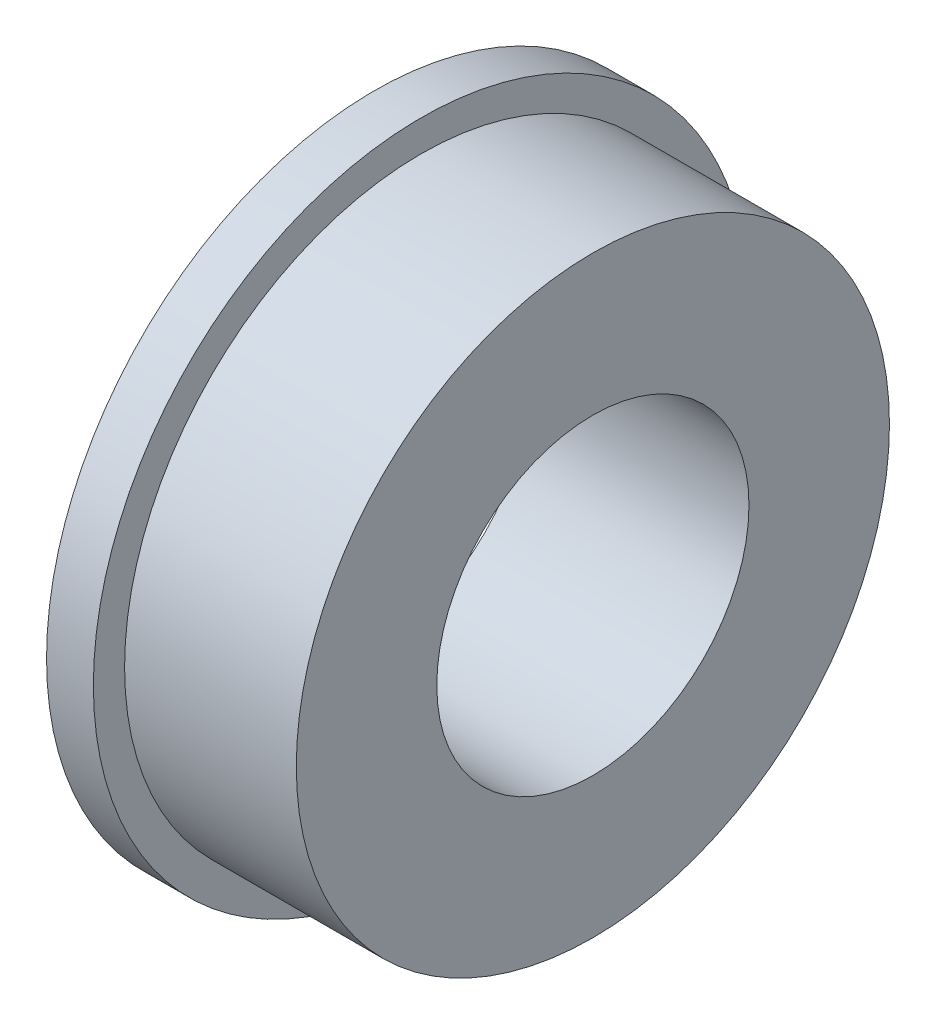
ISO-10303-21;
HEADER;
FILE_DESCRIPTION(('STEP AP214'),'2;1');
FILE_NAME('part.step','',(''),(''),'','','');
FILE_SCHEMA(('AUTOMOTIVE_DESIGN { 1 0 10303 214 1 1 1 1 }'));
ENDSEC;
DATA;
#1=APPLICATION_CONTEXT('core data for automotive mechanical design processes');
#2=APPLICATION_PROTOCOL_DEFINITION('international standard','automotive_design',2000,#1);
#3=PRODUCT_CONTEXT('',#1,'mechanical');
#4=PRODUCT('Part','Part','',(#3));
#5=PRODUCT_RELATED_PRODUCT_CATEGORY('part','',(#4));
#6=PRODUCT_DEFINITION_FORMATION('','',#4);
#7=PRODUCT_DEFINITION_CONTEXT('part definition',#1,'design');
#8=PRODUCT_DEFINITION('design','',#6,#7);
#9=PRODUCT_DEFINITION_SHAPE('','',#8);
#10=(LENGTH_UNIT() NAMED_UNIT(*) SI_UNIT(.MILLI.,.METRE.));
#11=(NAMED_UNIT(*) PLANE_ANGLE_UNIT() SI_UNIT($,.RADIAN.));
#12=(NAMED_UNIT(*) SI_UNIT($,.STERADIAN.) SOLID_ANGLE_UNIT());
#13=UNCERTAINTY_MEASURE_WITH_UNIT(LENGTH_MEASURE(1.E-05),#10,'distance_accuracy_value','');
#14=(GEOMETRIC_REPRESENTATION_CONTEXT(3) GLOBAL_UNCERTAINTY_ASSIGNED_CONTEXT((#13)) GLOBAL_UNIT_ASSIGNED_CONTEXT((#10,
#11,#12)) REPRESENTATION_CONTEXT('',''));
#15=CARTESIAN_POINT('',(0.,0.,0.));
#16=DIRECTION('',(0.,0.,1.));
#17=DIRECTION('',(1.,0.,0.));
#18=AXIS2_PLACEMENT_3D('',#15,#16,#17);
#19=CARTESIAN_POINT('',(-26.0941560134311,0.,0.));
#20=DIRECTION('',(-1.,0.,0.));
#21=DIRECTION('',(0.,0.,1.));
#22=AXIS2_PLACEMENT_3D('',#19,#20,#21);
#23=CYLINDRICAL_SURFACE('',#22,9.5);
#24=CARTESIAN_POINT('',(1.5,0.,0.));
#25=DIRECTION('',(-1.,0.,0.));
#26=DIRECTION('',(0.,0.,1.));
#27=AXIS2_PLACEMENT_3D('',#24,#25,#26);
#28=CIRCLE('',#27,9.5);
#29=CARTESIAN_POINT('',(1.5,0.,9.5));
#30=VERTEX_POINT('',#29);
#31=EDGE_CURVE('E33',#30,#30,#28,.F.);
#32=ORIENTED_EDGE('',*,*,#31,.T.);
#33=EDGE_LOOP('',(#32));
#34=FACE_BOUND('',#33,.T.);
#35=CARTESIAN_POINT('',(7.,0.,0.));
#36=DIRECTION('',(-1.,0.,0.));
#37=DIRECTION('',(0.,0.,1.));
#38=AXIS2_PLACEMENT_3D('',#35,#36,#37);
#39=CIRCLE('',#38,9.5);
#40=CARTESIAN_POINT('',(7.,0.,9.5));
#41=VERTEX_POINT('',#40);
#42=EDGE_CURVE('E17',#41,#41,#39,.T.);
#43=ORIENTED_EDGE('',*,*,#42,.T.);
#44=EDGE_LOOP('',(#43));
#45=FACE_BOUND('',#44,.T.);
#46=ADVANCED_FACE('F14',(#34,#45),#23,.T.);
#47=CARTESIAN_POINT('',(7.,9.5,0.));
#48=DIRECTION('',(-1.,0.,0.));
#49=DIRECTION('',(0.,0.,1.));
#50=AXIS2_PLACEMENT_3D('',#47,#48,#49);
#51=PLANE('',#50);
#52=CARTESIAN_POINT('',(7.,0.,0.));
#53=DIRECTION('',(-1.,0.,0.));
#54=DIRECTION('',(0.,0.,1.));
#55=AXIS2_PLACEMENT_3D('',#52,#53,#54);
#56=CIRCLE('',#55,5.);
#57=CARTESIAN_POINT('',(7.,0.,5.));
#58=VERTEX_POINT('',#57);
#59=EDGE_CURVE('E31',#58,#58,#56,.T.);
#60=ORIENTED_EDGE('',*,*,#59,.T.);
#61=EDGE_LOOP('',(#60));
#62=FACE_BOUND('',#61,.T.);
#63=ORIENTED_EDGE('',*,*,#42,.F.);
#64=EDGE_LOOP('',(#63));
#65=FACE_BOUND('',#64,.T.);
#66=ADVANCED_FACE('F41',(#62,#65),#51,.F.);
#67=CARTESIAN_POINT('',(1.5,10.5,0.));
#68=DIRECTION('',(-1.,0.,0.));
#69=DIRECTION('',(0.,0.,1.));
#70=AXIS2_PLACEMENT_3D('',#67,#68,#69);
#71=PLANE('',#70);
#72=ORIENTED_EDGE('',*,*,#31,.F.);
#73=EDGE_LOOP('',(#72));
#74=FACE_BOUND('',#73,.T.);
#75=CARTESIAN_POINT('',(1.5,0.,0.));
#76=DIRECTION('',(-1.,0.,0.));
#77=DIRECTION('',(0.,0.,1.));
#78=AXIS2_PLACEMENT_3D('',#75,#76,#77);
#79=CIRCLE('',#78,10.5);
#80=CARTESIAN_POINT('',(1.5,0.,10.5));
#81=VERTEX_POINT('',#80);
#82=EDGE_CURVE('E26',#81,#81,#79,.T.);
#83=ORIENTED_EDGE('',*,*,#82,.F.);
#84=EDGE_LOOP('',(#83));
#85=FACE_BOUND('',#84,.T.);
#86=ADVANCED_FACE('F43',(#74,#85),#71,.F.);
#87=CARTESIAN_POINT('',(-26.0941560134311,0.,0.));
#88=DIRECTION('',(-1.,0.,0.));
#89=DIRECTION('',(0.,0.,1.));
#90=AXIS2_PLACEMENT_3D('',#87,#88,#89);
#91=CYLINDRICAL_SURFACE('',#90,5.);
#92=ORIENTED_EDGE('',*,*,#59,.F.);
#93=EDGE_LOOP('',(#92));
#94=FACE_BOUND('',#93,.T.);
#95=CARTESIAN_POINT('',(0.,0.,0.));
#96=DIRECTION('',(-1.,0.,0.));
#97=DIRECTION('',(0.,0.,1.));
#98=AXIS2_PLACEMENT_3D('',#95,#96,#97);
#99=CIRCLE('',#98,5.);
#100=CARTESIAN_POINT('',(0.,0.,5.));
#101=VERTEX_POINT('',#100);
#102=EDGE_CURVE('E21',#101,#101,#99,.T.);
#103=ORIENTED_EDGE('',*,*,#102,.T.);
#104=EDGE_LOOP('',(#103));
#105=FACE_BOUND('',#104,.T.);
#106=ADVANCED_FACE('F50',(#94,#105),#91,.F.);
#107=CARTESIAN_POINT('',(-26.0941560134311,0.,0.));
#108=DIRECTION('',(-1.,0.,0.));
#109=DIRECTION('',(0.,0.,1.));
#110=AXIS2_PLACEMENT_3D('',#107,#108,#109);
#111=CYLINDRICAL_SURFACE('',#110,10.5);
#112=CARTESIAN_POINT('',(0.,0.,0.));
#113=DIRECTION('',(-1.,0.,0.));
#114=DIRECTION('',(0.,0.,1.));
#115=AXIS2_PLACEMENT_3D('',#112,#113,#114);
#116=CIRCLE('',#115,10.5);
#117=CARTESIAN_POINT('',(0.,0.,10.5));
#118=VERTEX_POINT('',#117);
#119=EDGE_CURVE('E10',#118,#118,#116,.F.);
#120=ORIENTED_EDGE('',*,*,#119,.T.);
#121=EDGE_LOOP('',(#120));
#122=FACE_BOUND('',#121,.T.);
#123=ORIENTED_EDGE('',*,*,#82,.T.);
#124=EDGE_LOOP('',(#123));
#125=FACE_BOUND('',#124,.T.);
#126=ADVANCED_FACE('F56',(#122,#125),#111,.T.);
#127=CARTESIAN_POINT('',(0.,5.,0.));
#128=DIRECTION('',(1.,0.,0.));
#129=DIRECTION('',(0.,0.,-1.));
#130=AXIS2_PLACEMENT_3D('',#127,#128,#129);
#131=PLANE('',#130);
#132=ORIENTED_EDGE('',*,*,#119,.F.);
#133=EDGE_LOOP('',(#132));
#134=FACE_BOUND('',#133,.T.);
#135=ORIENTED_EDGE('',*,*,#102,.F.);
#136=EDGE_LOOP('',(#135));
#137=FACE_BOUND('',#136,.T.);
#138=ADVANCED_FACE('F54',(#134,#137),#131,.F.);
#139=CLOSED_SHELL('',(#46,#66,#86,#106,#126,#138));
#140=MANIFOLD_SOLID_BREP('B1',#139);
#141=ADVANCED_BREP_SHAPE_REPRESENTATION('',(#18,#140),#14);
#142=SHAPE_DEFINITION_REPRESENTATION(#9,#141);
ENDSEC;
END-ISO-10303-21;
